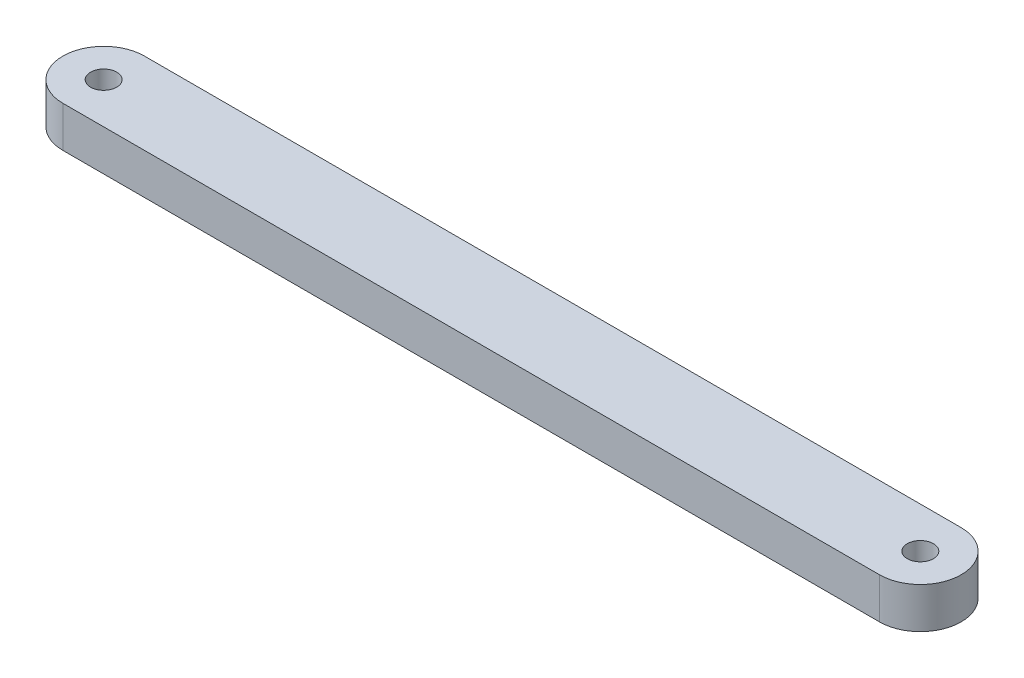
ISO-10303-21;
HEADER;
FILE_DESCRIPTION(('STEP AP214'),'2;1');
FILE_NAME('part.step','',(''),(''),'','','');
FILE_SCHEMA(('AUTOMOTIVE_DESIGN { 1 0 10303 214 1 1 1 1 }'));
ENDSEC;
DATA;
#1=APPLICATION_CONTEXT('core data for automotive mechanical design processes');
#2=APPLICATION_PROTOCOL_DEFINITION('international standard','automotive_design',2000,#1);
#3=PRODUCT_CONTEXT('',#1,'mechanical');
#4=PRODUCT('Part','Part','',(#3));
#5=PRODUCT_RELATED_PRODUCT_CATEGORY('part','',(#4));
#6=PRODUCT_DEFINITION_FORMATION('','',#4);
#7=PRODUCT_DEFINITION_CONTEXT('part definition',#1,'design');
#8=PRODUCT_DEFINITION('design','',#6,#7);
#9=PRODUCT_DEFINITION_SHAPE('','',#8);
#10=(LENGTH_UNIT() NAMED_UNIT(*) SI_UNIT(.MILLI.,.METRE.));
#11=(NAMED_UNIT(*) PLANE_ANGLE_UNIT() SI_UNIT($,.RADIAN.));
#12=(NAMED_UNIT(*) SI_UNIT($,.STERADIAN.) SOLID_ANGLE_UNIT());
#13=UNCERTAINTY_MEASURE_WITH_UNIT(LENGTH_MEASURE(1.E-05),#10,'distance_accuracy_value','');
#14=(GEOMETRIC_REPRESENTATION_CONTEXT(3) GLOBAL_UNCERTAINTY_ASSIGNED_CONTEXT((#13)) GLOBAL_UNIT_ASSIGNED_CONTEXT((#10,
#11,#12)) REPRESENTATION_CONTEXT('',''));
#15=CARTESIAN_POINT('',(0.,0.,0.));
#16=DIRECTION('',(0.,0.,1.));
#17=DIRECTION('',(1.,0.,0.));
#18=AXIS2_PLACEMENT_3D('',#15,#16,#17);
#19=CARTESIAN_POINT('',(100.,5.,0.));
#20=DIRECTION('',(0.,1.,0.));
#21=DIRECTION('',(0.,0.,1.));
#22=AXIS2_PLACEMENT_3D('',#19,#20,#21);
#23=PLANE('',#22);
#24=CARTESIAN_POINT('',(0.,5.,0.));
#25=DIRECTION('',(0.,1.,0.));
#26=DIRECTION('',(0.,0.,1.));
#27=AXIS2_PLACEMENT_3D('',#24,#25,#26);
#28=CIRCLE('',#27,1.6);
#29=CARTESIAN_POINT('',(0.,5.,1.6));
#30=VERTEX_POINT('',#29);
#31=EDGE_CURVE('E100',#30,#30,#28,.T.);
#32=ORIENTED_EDGE('',*,*,#31,.F.);
#33=EDGE_LOOP('',(#32));
#34=FACE_BOUND('',#33,.T.);
#35=CARTESIAN_POINT('',(100.,5.,0.));
#36=DIRECTION('',(0.,1.,0.));
#37=DIRECTION('',(0.,0.,1.));
#38=AXIS2_PLACEMENT_3D('',#35,#36,#37);
#39=CIRCLE('',#38,5.);
#40=CARTESIAN_POINT('',(100.,5.,5.));
#41=VERTEX_POINT('',#40);
#42=CARTESIAN_POINT('',(100.,5.,-5.));
#43=VERTEX_POINT('',#42);
#44=EDGE_CURVE('E85',#41,#43,#39,.T.);
#45=ORIENTED_EDGE('',*,*,#44,.T.);
#46=DIRECTION('',(-1.,0.,0.));
#47=VECTOR('',#46,1.);
#48=CARTESIAN_POINT('',(0.,5.,-5.));
#49=LINE('',#48,#47);
#50=CARTESIAN_POINT('',(0.,5.,-5.));
#51=VERTEX_POINT('',#50);
#52=EDGE_CURVE('E80',#43,#51,#49,.T.);
#53=ORIENTED_EDGE('',*,*,#52,.T.);
#54=CARTESIAN_POINT('',(0.,5.,0.));
#55=DIRECTION('',(0.,1.,0.));
#56=DIRECTION('',(0.,0.,1.));
#57=AXIS2_PLACEMENT_3D('',#54,#55,#56);
#58=CIRCLE('',#57,5.);
#59=CARTESIAN_POINT('',(0.,5.,5.));
#60=VERTEX_POINT('',#59);
#61=EDGE_CURVE('E83',#51,#60,#58,.T.);
#62=ORIENTED_EDGE('',*,*,#61,.T.);
#63=DIRECTION('',(1.,0.,0.));
#64=VECTOR('',#63,1.);
#65=CARTESIAN_POINT('',(0.,5.,5.));
#66=LINE('',#65,#64);
#67=EDGE_CURVE('E50',#60,#41,#66,.T.);
#68=ORIENTED_EDGE('',*,*,#67,.T.);
#69=EDGE_LOOP('',(#45,#53,#62,#68));
#70=FACE_BOUND('',#69,.T.);
#71=CARTESIAN_POINT('',(100.,5.,0.));
#72=DIRECTION('',(0.,1.,0.));
#73=DIRECTION('',(0.,0.,1.));
#74=AXIS2_PLACEMENT_3D('',#71,#72,#73);
#75=CIRCLE('',#74,1.60000000000001);
#76=CARTESIAN_POINT('',(100.,5.,1.60000000000001));
#77=VERTEX_POINT('',#76);
#78=EDGE_CURVE('E115',#77,#77,#75,.T.);
#79=ORIENTED_EDGE('',*,*,#78,.F.);
#80=EDGE_LOOP('',(#79));
#81=FACE_BOUND('',#80,.T.);
#82=ADVANCED_FACE('F33',(#34,#70,#81),#23,.T.);
#83=CARTESIAN_POINT('',(100.,0.,0.));
#84=DIRECTION('',(0.,1.,0.));
#85=DIRECTION('',(0.,0.,1.));
#86=AXIS2_PLACEMENT_3D('',#83,#84,#85);
#87=PLANE('',#86);
#88=CARTESIAN_POINT('',(100.,0.,0.));
#89=DIRECTION('',(0.,1.,0.));
#90=DIRECTION('',(0.,0.,1.));
#91=AXIS2_PLACEMENT_3D('',#88,#89,#90);
#92=CIRCLE('',#91,5.);
#93=CARTESIAN_POINT('',(100.,0.,5.));
#94=VERTEX_POINT('',#93);
#95=CARTESIAN_POINT('',(100.,0.,-5.));
#96=VERTEX_POINT('',#95);
#97=EDGE_CURVE('E97',#94,#96,#92,.T.);
#98=ORIENTED_EDGE('',*,*,#97,.F.);
#99=DIRECTION('',(1.,0.,0.));
#100=VECTOR('',#99,1.);
#101=CARTESIAN_POINT('',(0.,0.,5.));
#102=LINE('',#101,#100);
#103=CARTESIAN_POINT('',(0.,0.,5.));
#104=VERTEX_POINT('',#103);
#105=EDGE_CURVE('E73',#104,#94,#102,.T.);
#106=ORIENTED_EDGE('',*,*,#105,.F.);
#107=CARTESIAN_POINT('',(0.,0.,0.));
#108=DIRECTION('',(0.,1.,0.));
#109=DIRECTION('',(0.,0.,1.));
#110=AXIS2_PLACEMENT_3D('',#107,#108,#109);
#111=CIRCLE('',#110,5.);
#112=CARTESIAN_POINT('',(0.,0.,-5.));
#113=VERTEX_POINT('',#112);
#114=EDGE_CURVE('E67',#113,#104,#111,.T.);
#115=ORIENTED_EDGE('',*,*,#114,.F.);
#116=DIRECTION('',(-1.,0.,0.));
#117=VECTOR('',#116,1.);
#118=CARTESIAN_POINT('',(0.,0.,-5.));
#119=LINE('',#118,#117);
#120=EDGE_CURVE('E89',#96,#113,#119,.T.);
#121=ORIENTED_EDGE('',*,*,#120,.F.);
#122=EDGE_LOOP('',(#98,#106,#115,#121));
#123=FACE_BOUND('',#122,.T.);
#124=CARTESIAN_POINT('',(0.,0.,0.));
#125=DIRECTION('',(0.,1.,0.));
#126=DIRECTION('',(0.,0.,1.));
#127=AXIS2_PLACEMENT_3D('',#124,#125,#126);
#128=CIRCLE('',#127,1.6);
#129=CARTESIAN_POINT('',(0.,0.,1.6));
#130=VERTEX_POINT('',#129);
#131=EDGE_CURVE('E112',#130,#130,#128,.T.);
#132=ORIENTED_EDGE('',*,*,#131,.T.);
#133=EDGE_LOOP('',(#132));
#134=FACE_BOUND('',#133,.T.);
#135=CARTESIAN_POINT('',(100.,0.,0.));
#136=DIRECTION('',(0.,1.,0.));
#137=DIRECTION('',(0.,0.,1.));
#138=AXIS2_PLACEMENT_3D('',#135,#136,#137);
#139=CIRCLE('',#138,1.60000000000001);
#140=CARTESIAN_POINT('',(100.,0.,1.60000000000001));
#141=VERTEX_POINT('',#140);
#142=EDGE_CURVE('E118',#141,#141,#139,.T.);
#143=ORIENTED_EDGE('',*,*,#142,.T.);
#144=EDGE_LOOP('',(#143));
#145=FACE_BOUND('',#144,.T.);
#146=ADVANCED_FACE('F108',(#123,#134,#145),#87,.F.);
#147=CARTESIAN_POINT('',(100.,5.,0.));
#148=DIRECTION('',(0.,-1.,0.));
#149=DIRECTION('',(0.,0.,-1.));
#150=AXIS2_PLACEMENT_3D('',#147,#148,#149);
#151=CYLINDRICAL_SURFACE('',#150,5.);
#152=ORIENTED_EDGE('',*,*,#97,.T.);
#153=DIRECTION('',(0.,-1.,0.));
#154=VECTOR('',#153,1.);
#155=CARTESIAN_POINT('',(100.,5.,-5.));
#156=LINE('',#155,#154);
#157=EDGE_CURVE('E11',#43,#96,#156,.T.);
#158=ORIENTED_EDGE('',*,*,#157,.F.);
#159=ORIENTED_EDGE('',*,*,#44,.F.);
#160=DIRECTION('',(0.,-1.,0.));
#161=VECTOR('',#160,1.);
#162=CARTESIAN_POINT('',(100.,5.,5.));
#163=LINE('',#162,#161);
#164=EDGE_CURVE('E93',#41,#94,#163,.T.);
#165=ORIENTED_EDGE('',*,*,#164,.T.);
#166=EDGE_LOOP('',(#152,#158,#159,#165));
#167=FACE_BOUND('',#166,.T.);
#168=ADVANCED_FACE('F35',(#167),#151,.T.);
#169=CARTESIAN_POINT('',(0.,5.,-5.));
#170=DIRECTION('',(0.,0.,1.));
#171=DIRECTION('',(1.,0.,0.));
#172=AXIS2_PLACEMENT_3D('',#169,#170,#171);
#173=PLANE('',#172);
#174=ORIENTED_EDGE('',*,*,#120,.T.);
#175=DIRECTION('',(0.,-1.,0.));
#176=VECTOR('',#175,1.);
#177=CARTESIAN_POINT('',(0.,5.,-5.));
#178=LINE('',#177,#176);
#179=EDGE_CURVE('E42',#51,#113,#178,.T.);
#180=ORIENTED_EDGE('',*,*,#179,.F.);
#181=ORIENTED_EDGE('',*,*,#52,.F.);
#182=ORIENTED_EDGE('',*,*,#157,.T.);
#183=EDGE_LOOP('',(#174,#180,#181,#182));
#184=FACE_BOUND('',#183,.T.);
#185=ADVANCED_FACE('F88',(#184),#173,.F.);
#186=CARTESIAN_POINT('',(0.,5.,0.));
#187=DIRECTION('',(0.,-1.,0.));
#188=DIRECTION('',(0.,0.,-1.));
#189=AXIS2_PLACEMENT_3D('',#186,#187,#188);
#190=CYLINDRICAL_SURFACE('',#189,5.);
#191=ORIENTED_EDGE('',*,*,#114,.T.);
#192=DIRECTION('',(0.,-1.,0.));
#193=VECTOR('',#192,1.);
#194=CARTESIAN_POINT('',(0.,5.,5.));
#195=LINE('',#194,#193);
#196=EDGE_CURVE('E90',#60,#104,#195,.T.);
#197=ORIENTED_EDGE('',*,*,#196,.F.);
#198=ORIENTED_EDGE('',*,*,#61,.F.);
#199=ORIENTED_EDGE('',*,*,#179,.T.);
#200=EDGE_LOOP('',(#191,#197,#198,#199));
#201=FACE_BOUND('',#200,.T.);
#202=ADVANCED_FACE('F91',(#201),#190,.T.);
#203=CARTESIAN_POINT('',(0.,5.,5.));
#204=DIRECTION('',(0.,0.,-1.));
#205=DIRECTION('',(-1.,0.,0.));
#206=AXIS2_PLACEMENT_3D('',#203,#204,#205);
#207=PLANE('',#206);
#208=ORIENTED_EDGE('',*,*,#105,.T.);
#209=ORIENTED_EDGE('',*,*,#164,.F.);
#210=ORIENTED_EDGE('',*,*,#67,.F.);
#211=ORIENTED_EDGE('',*,*,#196,.T.);
#212=EDGE_LOOP('',(#208,#209,#210,#211));
#213=FACE_BOUND('',#212,.T.);
#214=ADVANCED_FACE('F105',(#213),#207,.F.);
#215=CARTESIAN_POINT('',(0.,5.,0.));
#216=DIRECTION('',(0.,-1.,0.));
#217=DIRECTION('',(0.,0.,-1.));
#218=AXIS2_PLACEMENT_3D('',#215,#216,#217);
#219=CYLINDRICAL_SURFACE('',#218,1.6);
#220=ORIENTED_EDGE('',*,*,#31,.T.);
#221=EDGE_LOOP('',(#220));
#222=FACE_BOUND('',#221,.T.);
#223=ORIENTED_EDGE('',*,*,#131,.F.);
#224=EDGE_LOOP('',(#223));
#225=FACE_BOUND('',#224,.T.);
#226=ADVANCED_FACE('F135',(#222,#225),#219,.F.);
#227=CARTESIAN_POINT('',(100.,5.,0.));
#228=DIRECTION('',(0.,-1.,0.));
#229=DIRECTION('',(0.,0.,-1.));
#230=AXIS2_PLACEMENT_3D('',#227,#228,#229);
#231=CYLINDRICAL_SURFACE('',#230,1.60000000000001);
#232=ORIENTED_EDGE('',*,*,#78,.T.);
#233=EDGE_LOOP('',(#232));
#234=FACE_BOUND('',#233,.T.);
#235=ORIENTED_EDGE('',*,*,#142,.F.);
#236=EDGE_LOOP('',(#235));
#237=FACE_BOUND('',#236,.T.);
#238=ADVANCED_FACE('F124',(#234,#237),#231,.F.);
#239=CLOSED_SHELL('',(#82,#146,#168,#185,#202,#214,#226,#238));
#240=MANIFOLD_SOLID_BREP('B2',#239);
#241=ADVANCED_BREP_SHAPE_REPRESENTATION('',(#18,#240),#14);
#242=SHAPE_DEFINITION_REPRESENTATION(#9,#241);
ENDSEC;
END-ISO-10303-21;
